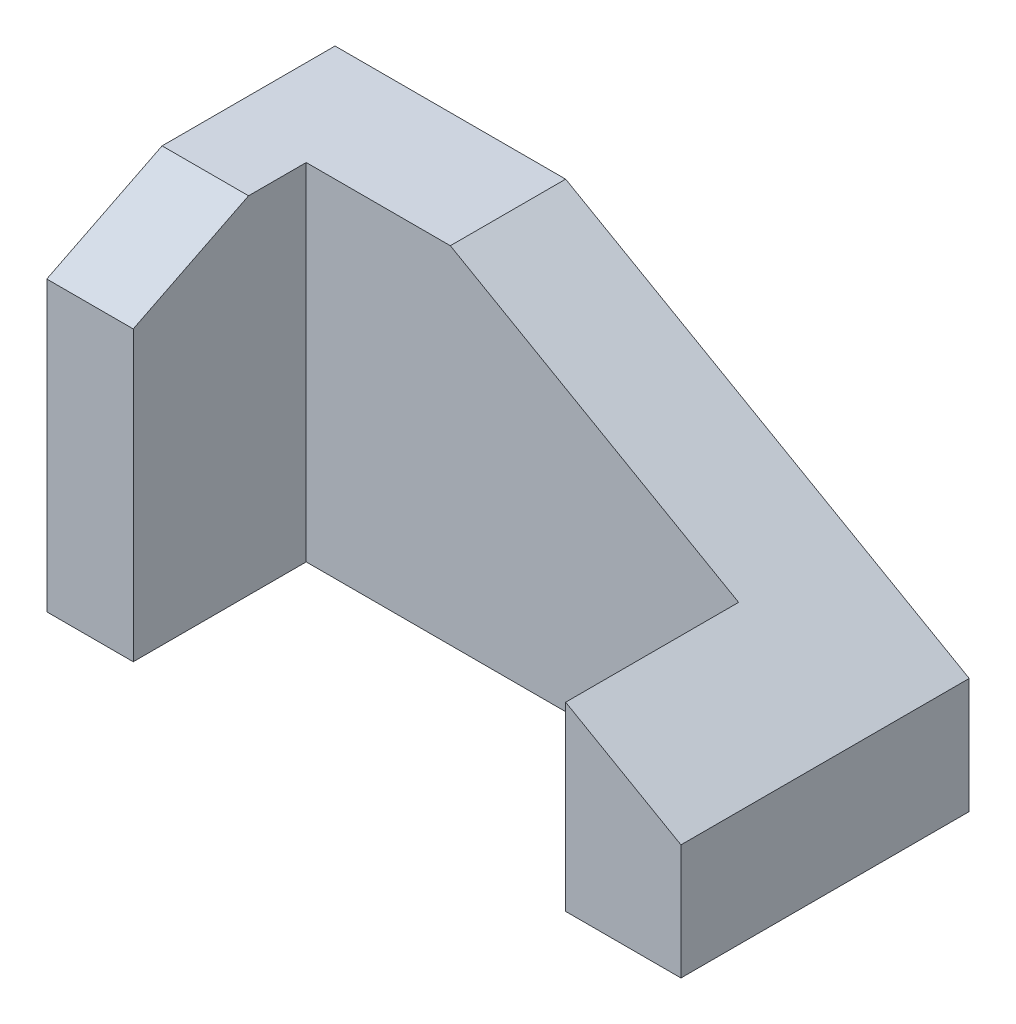
ISO-10303-21;
HEADER;
FILE_DESCRIPTION(('STEP AP214'),'2;1');
FILE_NAME('part.step','',(''),(''),'','','');
FILE_SCHEMA(('AUTOMOTIVE_DESIGN { 1 0 10303 214 1 1 1 1 }'));
ENDSEC;
DATA;
#1=APPLICATION_CONTEXT('core data for automotive mechanical design processes');
#2=APPLICATION_PROTOCOL_DEFINITION('international standard','automotive_design',2000,#1);
#3=PRODUCT_CONTEXT('',#1,'mechanical');
#4=PRODUCT('Part','Part','',(#3));
#5=PRODUCT_RELATED_PRODUCT_CATEGORY('part','',(#4));
#6=PRODUCT_DEFINITION_FORMATION('','',#4);
#7=PRODUCT_DEFINITION_CONTEXT('part definition',#1,'design');
#8=PRODUCT_DEFINITION('design','',#6,#7);
#9=PRODUCT_DEFINITION_SHAPE('','',#8);
#10=(LENGTH_UNIT() NAMED_UNIT(*) SI_UNIT(.MILLI.,.METRE.));
#11=(NAMED_UNIT(*) PLANE_ANGLE_UNIT() SI_UNIT($,.RADIAN.));
#12=(NAMED_UNIT(*) SI_UNIT($,.STERADIAN.) SOLID_ANGLE_UNIT());
#13=UNCERTAINTY_MEASURE_WITH_UNIT(LENGTH_MEASURE(1.E-05),#10,'distance_accuracy_value','');
#14=(GEOMETRIC_REPRESENTATION_CONTEXT(3) GLOBAL_UNCERTAINTY_ASSIGNED_CONTEXT((#13)) GLOBAL_UNIT_ASSIGNED_CONTEXT((#10,
#11,#12)) REPRESENTATION_CONTEXT('',''));
#15=CARTESIAN_POINT('',(0.,0.,0.));
#16=DIRECTION('',(0.,0.,1.));
#17=DIRECTION('',(1.,0.,0.));
#18=AXIS2_PLACEMENT_3D('',#15,#16,#17);
#19=CARTESIAN_POINT('',(0.,60.,0.));
#20=DIRECTION('',(0.,-1.,0.));
#21=DIRECTION('',(0.,0.,-1.));
#22=AXIS2_PLACEMENT_3D('',#19,#20,#21);
#23=PLANE('',#22);
#24=DIRECTION('',(-1.,0.,0.));
#25=VECTOR('',#24,1.);
#26=CARTESIAN_POINT('',(302.384219540401,60.,-20.));
#27=LINE('',#26,#25);
#28=CARTESIAN_POINT('',(15.,60.,-20.));
#29=VERTEX_POINT('',#28);
#30=CARTESIAN_POINT('',(0.,60.,-20.));
#31=VERTEX_POINT('',#30);
#32=EDGE_CURVE('E111',#29,#31,#27,.T.);
#33=ORIENTED_EDGE('',*,*,#32,.F.);
#34=DIRECTION('',(0.,0.,1.));
#35=VECTOR('',#34,1.);
#36=CARTESIAN_POINT('',(15.,60.,0.));
#37=LINE('',#36,#35);
#38=CARTESIAN_POINT('',(15.,60.,-30.));
#39=VERTEX_POINT('',#38);
#40=EDGE_CURVE('E165',#39,#29,#37,.T.);
#41=ORIENTED_EDGE('',*,*,#40,.F.);
#42=DIRECTION('',(-1.,0.,0.));
#43=VECTOR('',#42,1.);
#44=CARTESIAN_POINT('',(15.,60.,-30.));
#45=LINE('',#44,#43);
#46=CARTESIAN_POINT('',(40.,60.,-30.));
#47=VERTEX_POINT('',#46);
#48=EDGE_CURVE('E162',#47,#39,#45,.T.);
#49=ORIENTED_EDGE('',*,*,#48,.F.);
#50=DIRECTION('',(0.,0.,-1.));
#51=VECTOR('',#50,1.);
#52=CARTESIAN_POINT('',(40.,60.,168.634219540401));
#53=LINE('',#52,#51);
#54=CARTESIAN_POINT('',(40.,60.,-50.));
#55=VERTEX_POINT('',#54);
#56=EDGE_CURVE('E116',#47,#55,#53,.T.);
#57=ORIENTED_EDGE('',*,*,#56,.T.);
#58=DIRECTION('',(-1.,0.,0.));
#59=VECTOR('',#58,1.);
#60=CARTESIAN_POINT('',(0.,60.,-50.));
#61=LINE('',#60,#59);
#62=CARTESIAN_POINT('',(0.,60.,-50.));
#63=VERTEX_POINT('',#62);
#64=EDGE_CURVE('E139',#55,#63,#61,.T.);
#65=ORIENTED_EDGE('',*,*,#64,.T.);
#66=DIRECTION('',(0.,0.,1.));
#67=VECTOR('',#66,1.);
#68=CARTESIAN_POINT('',(0.,60.,0.));
#69=LINE('',#68,#67);
#70=EDGE_CURVE('E142',#63,#31,#69,.T.);
#71=ORIENTED_EDGE('',*,*,#70,.T.);
#72=EDGE_LOOP('',(#33,#41,#49,#57,#65,#71));
#73=FACE_BOUND('',#72,.T.);
#74=ADVANCED_FACE('F33',(#73),#23,.F.);
#75=CARTESIAN_POINT('',(110.,60.,0.));
#76=DIRECTION('',(-1.,0.,0.));
#77=DIRECTION('',(0.,0.,1.));
#78=AXIS2_PLACEMENT_3D('',#75,#76,#77);
#79=PLANE('',#78);
#80=DIRECTION('',(0.,0.,-1.));
#81=VECTOR('',#80,1.);
#82=CARTESIAN_POINT('',(110.,20.,168.634219540401));
#83=LINE('',#82,#81);
#84=CARTESIAN_POINT('',(110.,20.,0.));
#85=VERTEX_POINT('',#84);
#86=CARTESIAN_POINT('',(110.,20.,-50.));
#87=VERTEX_POINT('',#86);
#88=EDGE_CURVE('E55',#85,#87,#83,.T.);
#89=ORIENTED_EDGE('',*,*,#88,.F.);
#90=DIRECTION('',(0.,-1.,0.));
#91=VECTOR('',#90,1.);
#92=CARTESIAN_POINT('',(110.,60.,0.));
#93=LINE('',#92,#91);
#94=CARTESIAN_POINT('',(110.,0.,0.));
#95=VERTEX_POINT('',#94);
#96=EDGE_CURVE('E130',#85,#95,#93,.T.);
#97=ORIENTED_EDGE('',*,*,#96,.T.);
#98=DIRECTION('',(0.,0.,-1.));
#99=VECTOR('',#98,1.);
#100=CARTESIAN_POINT('',(110.,0.,0.));
#101=LINE('',#100,#99);
#102=CARTESIAN_POINT('',(110.,0.,-50.));
#103=VERTEX_POINT('',#102);
#104=EDGE_CURVE('E143',#95,#103,#101,.T.);
#105=ORIENTED_EDGE('',*,*,#104,.T.);
#106=DIRECTION('',(0.,-1.,0.));
#107=VECTOR('',#106,1.);
#108=CARTESIAN_POINT('',(110.,60.,-50.));
#109=LINE('',#108,#107);
#110=EDGE_CURVE('E133',#87,#103,#109,.T.);
#111=ORIENTED_EDGE('',*,*,#110,.F.);
#112=EDGE_LOOP('',(#89,#97,#105,#111));
#113=FACE_BOUND('',#112,.T.);
#114=ADVANCED_FACE('F196',(#113),#79,.F.);
#115=CARTESIAN_POINT('',(0.,60.,0.));
#116=DIRECTION('',(0.,0.,-1.));
#117=DIRECTION('',(-1.,0.,0.));
#118=AXIS2_PLACEMENT_3D('',#115,#116,#117);
#119=PLANE('',#118);
#120=DIRECTION('',(0.868243142124459,-0.496138938356834,0.));
#121=VECTOR('',#120,1.);
#122=CARTESIAN_POINT('',(9.84615384615384,77.2307692307692,0.));
#123=LINE('',#122,#121);
#124=CARTESIAN_POINT('',(90.,31.4285714285714,0.));
#125=VERTEX_POINT('',#124);
#126=EDGE_CURVE('E178',#125,#85,#123,.T.);
#127=ORIENTED_EDGE('',*,*,#126,.F.);
#128=DIRECTION('',(0.,1.,0.));
#129=VECTOR('',#128,1.);
#130=CARTESIAN_POINT('',(90.,0.,0.));
#131=LINE('',#130,#129);
#132=CARTESIAN_POINT('',(90.,0.,0.));
#133=VERTEX_POINT('',#132);
#134=EDGE_CURVE('E154',#133,#125,#131,.T.);
#135=ORIENTED_EDGE('',*,*,#134,.F.);
#136=DIRECTION('',(1.,0.,0.));
#137=VECTOR('',#136,1.);
#138=CARTESIAN_POINT('',(0.,0.,0.));
#139=LINE('',#138,#137);
#140=EDGE_CURVE('E148',#133,#95,#139,.T.);
#141=ORIENTED_EDGE('',*,*,#140,.T.);
#142=ORIENTED_EDGE('',*,*,#96,.F.);
#143=EDGE_LOOP('',(#127,#135,#141,#142));
#144=FACE_BOUND('',#143,.T.);
#145=ADVANCED_FACE('F192',(#144),#119,.F.);
#146=CARTESIAN_POINT('',(0.,60.,-50.));
#147=DIRECTION('',(0.,0.,1.));
#148=DIRECTION('',(1.,0.,0.));
#149=AXIS2_PLACEMENT_3D('',#146,#147,#148);
#150=PLANE('',#149);
#151=DIRECTION('',(-0.868243142124459,0.496138938356834,0.));
#152=VECTOR('',#151,1.);
#153=CARTESIAN_POINT('',(9.84615384615384,77.2307692307692,-50.));
#154=LINE('',#153,#152);
#155=EDGE_CURVE('E168',#87,#55,#154,.T.);
#156=ORIENTED_EDGE('',*,*,#155,.F.);
#157=ORIENTED_EDGE('',*,*,#110,.T.);
#158=DIRECTION('',(-1.,0.,0.));
#159=VECTOR('',#158,1.);
#160=CARTESIAN_POINT('',(0.,0.,-50.));
#161=LINE('',#160,#159);
#162=CARTESIAN_POINT('',(0.,0.,-50.));
#163=VERTEX_POINT('',#162);
#164=EDGE_CURVE('E140',#103,#163,#161,.T.);
#165=ORIENTED_EDGE('',*,*,#164,.T.);
#166=DIRECTION('',(0.,-1.,0.));
#167=VECTOR('',#166,1.);
#168=CARTESIAN_POINT('',(0.,60.,-50.));
#169=LINE('',#168,#167);
#170=EDGE_CURVE('E137',#63,#163,#169,.T.);
#171=ORIENTED_EDGE('',*,*,#170,.F.);
#172=ORIENTED_EDGE('',*,*,#64,.F.);
#173=EDGE_LOOP('',(#156,#157,#165,#171,#172));
#174=FACE_BOUND('',#173,.T.);
#175=ADVANCED_FACE('F202',(#174),#150,.F.);
#176=CARTESIAN_POINT('',(15.,0.,-30.));
#177=DIRECTION('',(0.,0.,-1.));
#178=DIRECTION('',(-1.,0.,0.));
#179=AXIS2_PLACEMENT_3D('',#176,#177,#178);
#180=PLANE('',#179);
#181=DIRECTION('',(0.868243142124459,-0.496138938356834,0.));
#182=VECTOR('',#181,1.);
#183=CARTESIAN_POINT('',(47.,56.,-30.));
#184=LINE('',#183,#182);
#185=CARTESIAN_POINT('',(90.,31.4285714285714,-30.));
#186=VERTEX_POINT('',#185);
#187=EDGE_CURVE('E181',#47,#186,#184,.T.);
#188=ORIENTED_EDGE('',*,*,#187,.F.);
#189=ORIENTED_EDGE('',*,*,#48,.T.);
#190=DIRECTION('',(0.,1.,0.));
#191=VECTOR('',#190,1.);
#192=CARTESIAN_POINT('',(15.,0.,-30.));
#193=LINE('',#192,#191);
#194=CARTESIAN_POINT('',(15.,0.,-30.));
#195=VERTEX_POINT('',#194);
#196=EDGE_CURVE('E150',#195,#39,#193,.T.);
#197=ORIENTED_EDGE('',*,*,#196,.F.);
#198=DIRECTION('',(-1.,0.,0.));
#199=VECTOR('',#198,1.);
#200=CARTESIAN_POINT('',(15.,0.,-30.));
#201=LINE('',#200,#199);
#202=CARTESIAN_POINT('',(90.,0.,-30.));
#203=VERTEX_POINT('',#202);
#204=EDGE_CURVE('E155',#203,#195,#201,.T.);
#205=ORIENTED_EDGE('',*,*,#204,.F.);
#206=DIRECTION('',(0.,1.,0.));
#207=VECTOR('',#206,1.);
#208=CARTESIAN_POINT('',(90.,0.,-30.));
#209=LINE('',#208,#207);
#210=EDGE_CURVE('E157',#203,#186,#209,.T.);
#211=ORIENTED_EDGE('',*,*,#210,.T.);
#212=EDGE_LOOP('',(#188,#189,#197,#205,#211));
#213=FACE_BOUND('',#212,.T.);
#214=ADVANCED_FACE('F208',(#213),#180,.F.);
#215=CARTESIAN_POINT('',(90.,0.,0.));
#216=DIRECTION('',(1.,0.,0.));
#217=DIRECTION('',(0.,0.,-1.));
#218=AXIS2_PLACEMENT_3D('',#215,#216,#217);
#219=PLANE('',#218);
#220=DIRECTION('',(0.,0.,1.));
#221=VECTOR('',#220,1.);
#222=CARTESIAN_POINT('',(90.,31.4285714285714,0.));
#223=LINE('',#222,#221);
#224=EDGE_CURVE('E41',#186,#125,#223,.T.);
#225=ORIENTED_EDGE('',*,*,#224,.F.);
#226=ORIENTED_EDGE('',*,*,#210,.F.);
#227=DIRECTION('',(0.,0.,-1.));
#228=VECTOR('',#227,1.);
#229=CARTESIAN_POINT('',(90.,0.,0.));
#230=LINE('',#229,#228);
#231=EDGE_CURVE('E171',#133,#203,#230,.T.);
#232=ORIENTED_EDGE('',*,*,#231,.F.);
#233=ORIENTED_EDGE('',*,*,#134,.T.);
#234=EDGE_LOOP('',(#225,#226,#232,#233));
#235=FACE_BOUND('',#234,.T.);
#236=ADVANCED_FACE('F211',(#235),#219,.F.);
#237=DIRECTION('',(0.,1.,0.));
#238=VECTOR('',#237,1.);
#239=CARTESIAN_POINT('',(15.,0.,0.));
#240=LINE('',#239,#238);
#241=CARTESIAN_POINT('',(15.,0.,0.));
#242=VERTEX_POINT('',#241);
#243=CARTESIAN_POINT('',(15.,50.,0.));
#244=VERTEX_POINT('',#243);
#245=EDGE_CURVE('E124',#242,#244,#240,.T.);
#246=ORIENTED_EDGE('',*,*,#245,.T.);
#247=DIRECTION('',(-1.,0.,0.));
#248=VECTOR('',#247,1.);
#249=CARTESIAN_POINT('',(302.384219540401,50.,0.));
#250=LINE('',#249,#248);
#251=CARTESIAN_POINT('',(0.,50.,0.));
#252=VERTEX_POINT('',#251);
#253=EDGE_CURVE('E48',#244,#252,#250,.T.);
#254=ORIENTED_EDGE('',*,*,#253,.T.);
#255=DIRECTION('',(0.,-1.,0.));
#256=VECTOR('',#255,1.);
#257=CARTESIAN_POINT('',(0.,60.,0.));
#258=LINE('',#257,#256);
#259=CARTESIAN_POINT('',(0.,0.,0.));
#260=VERTEX_POINT('',#259);
#261=EDGE_CURVE('E122',#252,#260,#258,.T.);
#262=ORIENTED_EDGE('',*,*,#261,.T.);
#263=EDGE_CURVE('E146',#260,#242,#139,.T.);
#264=ORIENTED_EDGE('',*,*,#263,.T.);
#265=EDGE_LOOP('',(#246,#254,#262,#264));
#266=FACE_BOUND('',#265,.T.);
#267=ADVANCED_FACE('F120',(#266),#119,.F.);
#268=CARTESIAN_POINT('',(0.,60.,0.));
#269=DIRECTION('',(1.,0.,0.));
#270=DIRECTION('',(0.,0.,-1.));
#271=AXIS2_PLACEMENT_3D('',#268,#269,#270);
#272=PLANE('',#271);
#273=ORIENTED_EDGE('',*,*,#261,.F.);
#274=DIRECTION('',(0.,0.447213595499958,-0.894427190999916));
#275=VECTOR('',#274,1.);
#276=CARTESIAN_POINT('',(0.,52.,-4.));
#277=LINE('',#276,#275);
#278=EDGE_CURVE('E108',#252,#31,#277,.T.);
#279=ORIENTED_EDGE('',*,*,#278,.T.);
#280=ORIENTED_EDGE('',*,*,#70,.F.);
#281=ORIENTED_EDGE('',*,*,#170,.T.);
#282=DIRECTION('',(0.,0.,1.));
#283=VECTOR('',#282,1.);
#284=CARTESIAN_POINT('',(0.,0.,0.));
#285=LINE('',#284,#283);
#286=EDGE_CURVE('E129',#163,#260,#285,.T.);
#287=ORIENTED_EDGE('',*,*,#286,.T.);
#288=EDGE_LOOP('',(#273,#279,#280,#281,#287));
#289=FACE_BOUND('',#288,.T.);
#290=ADVANCED_FACE('F35',(#289),#272,.F.);
#291=CARTESIAN_POINT('',(0.,0.,0.));
#292=DIRECTION('',(0.,-1.,0.));
#293=DIRECTION('',(0.,0.,-1.));
#294=AXIS2_PLACEMENT_3D('',#291,#292,#293);
#295=PLANE('',#294);
#296=DIRECTION('',(0.,0.,1.));
#297=VECTOR('',#296,1.);
#298=CARTESIAN_POINT('',(15.,0.,0.));
#299=LINE('',#298,#297);
#300=EDGE_CURVE('E164',#195,#242,#299,.T.);
#301=ORIENTED_EDGE('',*,*,#300,.T.);
#302=ORIENTED_EDGE('',*,*,#263,.F.);
#303=ORIENTED_EDGE('',*,*,#286,.F.);
#304=ORIENTED_EDGE('',*,*,#164,.F.);
#305=ORIENTED_EDGE('',*,*,#104,.F.);
#306=ORIENTED_EDGE('',*,*,#140,.F.);
#307=ORIENTED_EDGE('',*,*,#231,.T.);
#308=ORIENTED_EDGE('',*,*,#204,.T.);
#309=EDGE_LOOP('',(#301,#302,#303,#304,#305,#306,#307,#308));
#310=FACE_BOUND('',#309,.T.);
#311=ADVANCED_FACE('F199',(#310),#295,.T.);
#312=CARTESIAN_POINT('',(15.,0.,0.));
#313=DIRECTION('',(-1.,0.,0.));
#314=DIRECTION('',(0.,0.,1.));
#315=AXIS2_PLACEMENT_3D('',#312,#313,#314);
#316=PLANE('',#315);
#317=ORIENTED_EDGE('',*,*,#40,.T.);
#318=DIRECTION('',(0.,-0.447213595499958,0.894427190999916));
#319=VECTOR('',#318,1.);
#320=CARTESIAN_POINT('',(15.,40.,20.));
#321=LINE('',#320,#319);
#322=EDGE_CURVE('E11',#29,#244,#321,.T.);
#323=ORIENTED_EDGE('',*,*,#322,.T.);
#324=ORIENTED_EDGE('',*,*,#245,.F.);
#325=ORIENTED_EDGE('',*,*,#300,.F.);
#326=ORIENTED_EDGE('',*,*,#196,.T.);
#327=EDGE_LOOP('',(#317,#323,#324,#325,#326));
#328=FACE_BOUND('',#327,.T.);
#329=ADVANCED_FACE('F214',(#328),#316,.F.);
#330=CARTESIAN_POINT('',(40.,60.,168.634219540401));
#331=DIRECTION('',(0.496138938356834,0.868243142124459,0.));
#332=DIRECTION('',(-0.868243142124459,0.496138938356834,0.));
#333=AXIS2_PLACEMENT_3D('',#330,#331,#332);
#334=PLANE('',#333);
#335=ORIENTED_EDGE('',*,*,#88,.T.);
#336=ORIENTED_EDGE('',*,*,#155,.T.);
#337=ORIENTED_EDGE('',*,*,#56,.F.);
#338=ORIENTED_EDGE('',*,*,#187,.T.);
#339=ORIENTED_EDGE('',*,*,#224,.T.);
#340=ORIENTED_EDGE('',*,*,#126,.T.);
#341=EDGE_LOOP('',(#335,#336,#337,#338,#339,#340));
#342=FACE_BOUND('',#341,.T.);
#343=ADVANCED_FACE('F187',(#342),#334,.T.);
#344=CARTESIAN_POINT('',(302.384219540401,60.,-20.));
#345=DIRECTION('',(0.,-0.894427190999916,-0.447213595499958));
#346=DIRECTION('',(0.,0.447213595499958,-0.894427190999916));
#347=AXIS2_PLACEMENT_3D('',#344,#345,#346);
#348=PLANE('',#347);
#349=ORIENTED_EDGE('',*,*,#278,.F.);
#350=ORIENTED_EDGE('',*,*,#253,.F.);
#351=ORIENTED_EDGE('',*,*,#322,.F.);
#352=ORIENTED_EDGE('',*,*,#32,.T.);
#353=EDGE_LOOP('',(#349,#350,#351,#352));
#354=FACE_BOUND('',#353,.T.);
#355=ADVANCED_FACE('F109',(#354),#348,.F.);
#356=CLOSED_SHELL('',(#74,#114,#145,#175,#214,#236,#267,#290,#311,#329,#343,#355));
#357=MANIFOLD_SOLID_BREP('B2',#356);
#358=ADVANCED_BREP_SHAPE_REPRESENTATION('',(#18,#357),#14);
#359=SHAPE_DEFINITION_REPRESENTATION(#9,#358);
ENDSEC;
END-ISO-10303-21;
